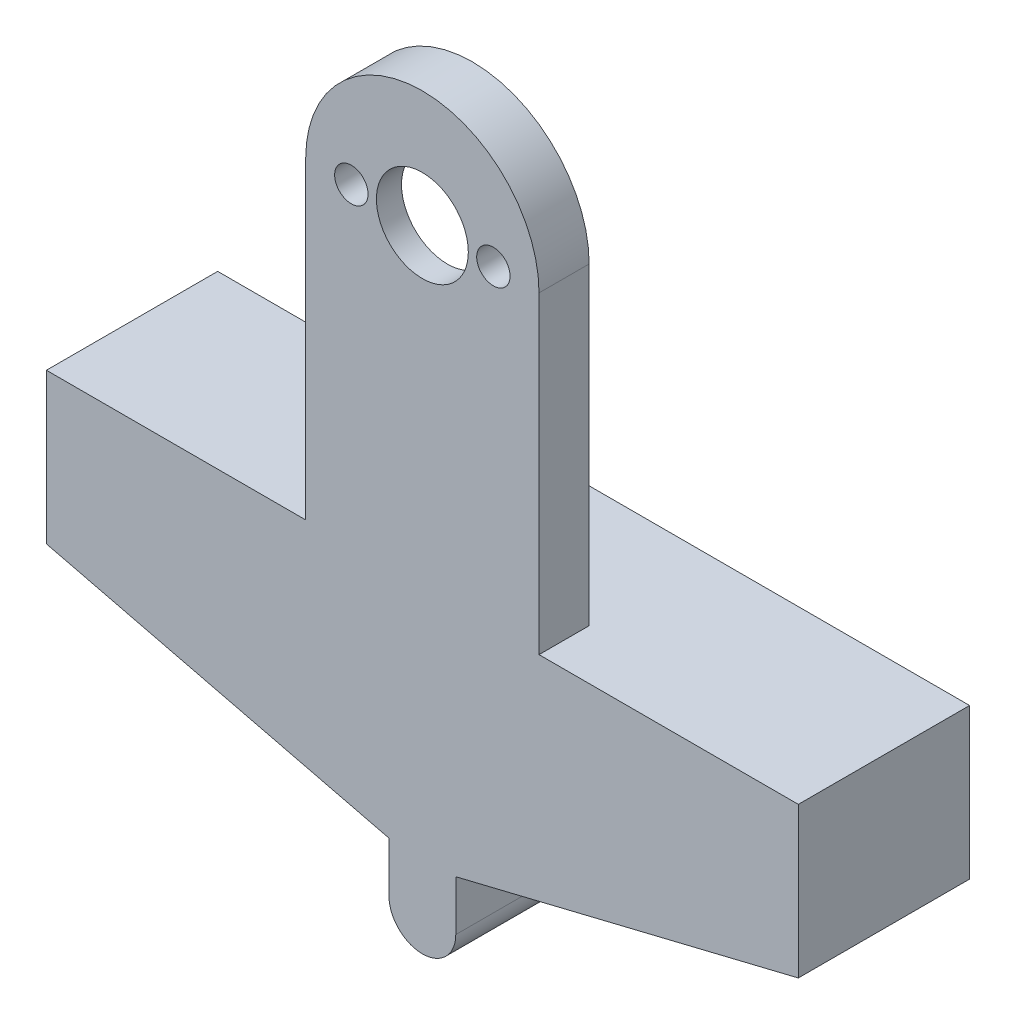
ISO-10303-21;
HEADER;
FILE_DESCRIPTION(('STEP AP214'),'2;1');
FILE_NAME('part.step','',(''),(''),'','','');
FILE_SCHEMA(('AUTOMOTIVE_DESIGN { 1 0 10303 214 1 1 1 1 }'));
ENDSEC;
DATA;
#1=APPLICATION_CONTEXT('core data for automotive mechanical design processes');
#2=APPLICATION_PROTOCOL_DEFINITION('international standard','automotive_design',2000,#1);
#3=PRODUCT_CONTEXT('',#1,'mechanical');
#4=PRODUCT('Part','Part','',(#3));
#5=PRODUCT_RELATED_PRODUCT_CATEGORY('part','',(#4));
#6=PRODUCT_DEFINITION_FORMATION('','',#4);
#7=PRODUCT_DEFINITION_CONTEXT('part definition',#1,'design');
#8=PRODUCT_DEFINITION('design','',#6,#7);
#9=PRODUCT_DEFINITION_SHAPE('','',#8);
#10=(LENGTH_UNIT() NAMED_UNIT(*) SI_UNIT(.MILLI.,.METRE.));
#11=(NAMED_UNIT(*) PLANE_ANGLE_UNIT() SI_UNIT($,.RADIAN.));
#12=(NAMED_UNIT(*) SI_UNIT($,.STERADIAN.) SOLID_ANGLE_UNIT());
#13=UNCERTAINTY_MEASURE_WITH_UNIT(LENGTH_MEASURE(1.E-05),#10,'distance_accuracy_value','');
#14=(GEOMETRIC_REPRESENTATION_CONTEXT(3) GLOBAL_UNCERTAINTY_ASSIGNED_CONTEXT((#13)) GLOBAL_UNIT_ASSIGNED_CONTEXT((#10,
#11,#12)) REPRESENTATION_CONTEXT('',''));
#15=CARTESIAN_POINT('',(0.,0.,0.));
#16=DIRECTION('',(0.,0.,1.));
#17=DIRECTION('',(1.,0.,0.));
#18=AXIS2_PLACEMENT_3D('',#15,#16,#17);
#19=CARTESIAN_POINT('',(-8.50000000000001,46.5,8.));
#20=DIRECTION('',(0.,0.,1.));
#21=DIRECTION('',(1.,0.,0.));
#22=AXIS2_PLACEMENT_3D('',#19,#20,#21);
#23=CYLINDRICAL_SURFACE('',#22,2.);
#24=CARTESIAN_POINT('',(-8.50000000000001,46.5,14.));
#25=DIRECTION('',(0.,0.,1.));
#26=DIRECTION('',(1.,0.,0.));
#27=AXIS2_PLACEMENT_3D('',#24,#25,#26);
#28=CIRCLE('',#27,2.);
#29=CARTESIAN_POINT('',(-6.5,46.5,14.));
#30=VERTEX_POINT('',#29);
#31=EDGE_CURVE('E250',#30,#30,#28,.T.);
#32=ORIENTED_EDGE('',*,*,#31,.T.);
#33=EDGE_LOOP('',(#32));
#34=FACE_BOUND('',#33,.T.);
#35=CARTESIAN_POINT('',(-8.50000000000001,46.5,11.));
#36=DIRECTION('',(0.,0.,-1.));
#37=DIRECTION('',(-1.,0.,0.));
#38=AXIS2_PLACEMENT_3D('',#35,#36,#37);
#39=CIRCLE('',#38,2.);
#40=CARTESIAN_POINT('',(-10.5,46.5,11.));
#41=VERTEX_POINT('',#40);
#42=EDGE_CURVE('E235',#41,#41,#39,.F.);
#43=ORIENTED_EDGE('',*,*,#42,.F.);
#44=EDGE_LOOP('',(#43));
#45=FACE_BOUND('',#44,.T.);
#46=ADVANCED_FACE('F41',(#34,#45),#23,.F.);
#47=CARTESIAN_POINT('',(8.49999999999999,46.5,8.));
#48=DIRECTION('',(0.,0.,1.));
#49=DIRECTION('',(1.,0.,0.));
#50=AXIS2_PLACEMENT_3D('',#47,#48,#49);
#51=CYLINDRICAL_SURFACE('',#50,2.);
#52=CARTESIAN_POINT('',(8.49999999999999,46.5,14.));
#53=DIRECTION('',(0.,0.,1.));
#54=DIRECTION('',(1.,0.,0.));
#55=AXIS2_PLACEMENT_3D('',#52,#53,#54);
#56=CIRCLE('',#55,2.);
#57=CARTESIAN_POINT('',(10.5,46.5,14.));
#58=VERTEX_POINT('',#57);
#59=EDGE_CURVE('E246',#58,#58,#56,.T.);
#60=ORIENTED_EDGE('',*,*,#59,.T.);
#61=EDGE_LOOP('',(#60));
#62=FACE_BOUND('',#61,.T.);
#63=CARTESIAN_POINT('',(8.49999999999999,46.5,11.));
#64=DIRECTION('',(0.,0.,-1.));
#65=DIRECTION('',(-1.,0.,0.));
#66=AXIS2_PLACEMENT_3D('',#63,#64,#65);
#67=CIRCLE('',#66,2.);
#68=CARTESIAN_POINT('',(6.5,46.5,11.));
#69=VERTEX_POINT('',#68);
#70=EDGE_CURVE('E944',#69,#69,#67,.F.);
#71=ORIENTED_EDGE('',*,*,#70,.F.);
#72=EDGE_LOOP('',(#71));
#73=FACE_BOUND('',#72,.T.);
#74=ADVANCED_FACE('F544',(#62,#73),#51,.F.);
#75=CARTESIAN_POINT('',(0.,46.5,8.));
#76=DIRECTION('',(0.,0.,1.));
#77=DIRECTION('',(1.,0.,0.));
#78=AXIS2_PLACEMENT_3D('',#75,#76,#77);
#79=CYLINDRICAL_SURFACE('',#78,5.5);
#80=CARTESIAN_POINT('',(0.,46.5,14.));
#81=DIRECTION('',(0.,0.,1.));
#82=DIRECTION('',(1.,0.,0.));
#83=AXIS2_PLACEMENT_3D('',#80,#81,#82);
#84=CIRCLE('',#83,5.5);
#85=CARTESIAN_POINT('',(5.49999999999999,46.5,14.));
#86=VERTEX_POINT('',#85);
#87=EDGE_CURVE('E242',#86,#86,#84,.T.);
#88=ORIENTED_EDGE('',*,*,#87,.T.);
#89=EDGE_LOOP('',(#88));
#90=FACE_BOUND('',#89,.T.);
#91=CARTESIAN_POINT('',(0.,46.5,11.));
#92=DIRECTION('',(0.,0.,-1.));
#93=DIRECTION('',(-1.,0.,0.));
#94=AXIS2_PLACEMENT_3D('',#91,#92,#93);
#95=CIRCLE('',#94,5.5);
#96=CARTESIAN_POINT('',(-5.50000000000001,46.5,11.));
#97=VERTEX_POINT('',#96);
#98=EDGE_CURVE('E45',#97,#97,#95,.F.);
#99=ORIENTED_EDGE('',*,*,#98,.F.);
#100=EDGE_LOOP('',(#99));
#101=FACE_BOUND('',#100,.T.);
#102=ADVANCED_FACE('F541',(#90,#101),#79,.F.);
#103=CARTESIAN_POINT('',(0.,0.,0.));
#104=DIRECTION('',(0.,0.,1.));
#105=DIRECTION('',(1.,0.,0.));
#106=AXIS2_PLACEMENT_3D('',#103,#104,#105);
#107=PLANE('',#106);
#108=DIRECTION('',(0.,-1.,0.));
#109=VECTOR('',#108,1.);
#110=CARTESIAN_POINT('',(4.,0.,0.));
#111=LINE('',#110,#109);
#112=CARTESIAN_POINT('',(4.,-9.,0.));
#113=VERTEX_POINT('',#112);
#114=CARTESIAN_POINT('',(4.00000000000001,-19.,0.));
#115=VERTEX_POINT('',#114);
#116=EDGE_CURVE('E357',#113,#115,#111,.T.);
#117=ORIENTED_EDGE('',*,*,#116,.F.);
#118=DIRECTION('',(1.,0.,0.));
#119=VECTOR('',#118,1.);
#120=CARTESIAN_POINT('',(0.,-9.,0.));
#121=LINE('',#120,#119);
#122=CARTESIAN_POINT('',(45.,-9.,0.));
#123=VERTEX_POINT('',#122);
#124=EDGE_CURVE('E271',#113,#123,#121,.T.);
#125=ORIENTED_EDGE('',*,*,#124,.T.);
#126=DIRECTION('',(0.97152033878313,0.236956180191007,0.));
#127=VECTOR('',#126,1.);
#128=CARTESIAN_POINT('',(4.5985401459854,-18.8540145985401,0.));
#129=LINE('',#128,#127);
#130=EDGE_CURVE('E363',#115,#123,#129,.T.);
#131=ORIENTED_EDGE('',*,*,#130,.F.);
#132=EDGE_LOOP('',(#117,#125,#131));
#133=FACE_BOUND('',#132,.T.);
#134=ADVANCED_FACE('F528',(#133),#107,.F.);
#135=CARTESIAN_POINT('',(4.,0.,14.));
#136=DIRECTION('',(1.,0.,0.));
#137=DIRECTION('',(0.,1.,0.));
#138=AXIS2_PLACEMENT_3D('',#135,#136,#137);
#139=PLANE('',#138);
#140=DIRECTION('',(0.,-1.,0.));
#141=VECTOR('',#140,1.);
#142=CARTESIAN_POINT('',(4.,0.,14.));
#143=LINE('',#142,#141);
#144=CARTESIAN_POINT('',(4.00000000000001,-19.,14.));
#145=VERTEX_POINT('',#144);
#146=CARTESIAN_POINT('',(4.00000000000001,-25.,14.));
#147=VERTEX_POINT('',#146);
#148=EDGE_CURVE('E400',#145,#147,#143,.T.);
#149=ORIENTED_EDGE('',*,*,#148,.T.);
#150=DIRECTION('',(0.,0.,-1.));
#151=VECTOR('',#150,1.);
#152=CARTESIAN_POINT('',(4.00000000000001,-25.,14.));
#153=LINE('',#152,#151);
#154=CARTESIAN_POINT('',(4.00000000000001,-25.,-6.5));
#155=VERTEX_POINT('',#154);
#156=EDGE_CURVE('E11',#147,#155,#153,.T.);
#157=ORIENTED_EDGE('',*,*,#156,.T.);
#158=DIRECTION('',(0.,-1.,0.));
#159=VECTOR('',#158,1.);
#160=CARTESIAN_POINT('',(4.,0.,-6.5));
#161=LINE('',#160,#159);
#162=CARTESIAN_POINT('',(4.,-9.,-6.5));
#163=VERTEX_POINT('',#162);
#164=EDGE_CURVE('E305',#163,#155,#161,.T.);
#165=ORIENTED_EDGE('',*,*,#164,.F.);
#166=DIRECTION('',(0.,0.,1.));
#167=VECTOR('',#166,1.);
#168=CARTESIAN_POINT('',(4.,-9.,-6.5));
#169=LINE('',#168,#167);
#170=EDGE_CURVE('E367',#163,#113,#169,.T.);
#171=ORIENTED_EDGE('',*,*,#170,.T.);
#172=ORIENTED_EDGE('',*,*,#116,.T.);
#173=DIRECTION('',(0.,0.,-1.));
#174=VECTOR('',#173,1.);
#175=CARTESIAN_POINT('',(4.00000000000001,-19.,14.));
#176=LINE('',#175,#174);
#177=EDGE_CURVE('E452',#145,#115,#176,.T.);
#178=ORIENTED_EDGE('',*,*,#177,.F.);
#179=EDGE_LOOP('',(#149,#157,#165,#171,#172,#178));
#180=FACE_BOUND('',#179,.T.);
#181=ADVANCED_FACE('F484',(#180),#139,.T.);
#182=CARTESIAN_POINT('',(4.5985401459854,-18.8540145985401,14.));
#183=DIRECTION('',(-0.236956180191007,0.97152033878313,0.));
#184=DIRECTION('',(-0.97152033878313,-0.236956180191007,0.));
#185=AXIS2_PLACEMENT_3D('',#182,#183,#184);
#186=PLANE('',#185);
#187=ORIENTED_EDGE('',*,*,#130,.T.);
#188=DIRECTION('',(0.,0.,-1.));
#189=VECTOR('',#188,1.);
#190=CARTESIAN_POINT('',(45.,-9.,14.));
#191=LINE('',#190,#189);
#192=CARTESIAN_POINT('',(45.,-9.,14.));
#193=VERTEX_POINT('',#192);
#194=EDGE_CURVE('E448',#193,#123,#191,.T.);
#195=ORIENTED_EDGE('',*,*,#194,.F.);
#196=DIRECTION('',(0.97152033878313,0.236956180191007,0.));
#197=VECTOR('',#196,1.);
#198=CARTESIAN_POINT('',(4.5985401459854,-18.8540145985401,14.));
#199=LINE('',#198,#197);
#200=EDGE_CURVE('E404',#145,#193,#199,.T.);
#201=ORIENTED_EDGE('',*,*,#200,.F.);
#202=ORIENTED_EDGE('',*,*,#177,.T.);
#203=EDGE_LOOP('',(#187,#195,#201,#202));
#204=FACE_BOUND('',#203,.T.);
#205=ADVANCED_FACE('F491',(#204),#186,.F.);
#206=CARTESIAN_POINT('',(45.,0.,14.));
#207=DIRECTION('',(-1.,0.,0.));
#208=DIRECTION('',(0.,0.,1.));
#209=AXIS2_PLACEMENT_3D('',#206,#207,#208);
#210=PLANE('',#209);
#211=ORIENTED_EDGE('',*,*,#194,.T.);
#212=DIRECTION('',(0.,0.,1.));
#213=VECTOR('',#212,1.);
#214=CARTESIAN_POINT('',(45.,-9.,-6.5));
#215=LINE('',#214,#213);
#216=CARTESIAN_POINT('',(45.,-9.,-6.5));
#217=VERTEX_POINT('',#216);
#218=EDGE_CURVE('E364',#217,#123,#215,.T.);
#219=ORIENTED_EDGE('',*,*,#218,.F.);
#220=DIRECTION('',(0.,1.,0.));
#221=VECTOR('',#220,1.);
#222=CARTESIAN_POINT('',(45.,0.,-6.5));
#223=LINE('',#222,#221);
#224=CARTESIAN_POINT('',(45.,9.00000000000001,-6.5));
#225=VERTEX_POINT('',#224);
#226=EDGE_CURVE('E309',#217,#225,#223,.T.);
#227=ORIENTED_EDGE('',*,*,#226,.T.);
#228=DIRECTION('',(0.,0.,-1.));
#229=VECTOR('',#228,1.);
#230=CARTESIAN_POINT('',(45.,9.00000000000001,14.));
#231=LINE('',#230,#229);
#232=CARTESIAN_POINT('',(45.,9.00000000000001,14.));
#233=VERTEX_POINT('',#232);
#234=EDGE_CURVE('E445',#233,#225,#231,.T.);
#235=ORIENTED_EDGE('',*,*,#234,.F.);
#236=DIRECTION('',(0.,1.,0.));
#237=VECTOR('',#236,1.);
#238=CARTESIAN_POINT('',(45.,0.,14.));
#239=LINE('',#238,#237);
#240=EDGE_CURVE('E408',#193,#233,#239,.T.);
#241=ORIENTED_EDGE('',*,*,#240,.F.);
#242=EDGE_LOOP('',(#211,#219,#227,#235,#241));
#243=FACE_BOUND('',#242,.T.);
#244=ADVANCED_FACE('F496',(#243),#210,.F.);
#245=CARTESIAN_POINT('',(0.,9.00000000000001,14.));
#246=DIRECTION('',(0.,1.,0.));
#247=DIRECTION('',(0.,0.,1.));
#248=AXIS2_PLACEMENT_3D('',#245,#246,#247);
#249=PLANE('',#248);
#250=DIRECTION('',(0.,0.,1.));
#251=VECTOR('',#250,1.);
#252=CARTESIAN_POINT('',(-13.964514824375,9.00000000000001,8.));
#253=LINE('',#252,#251);
#254=CARTESIAN_POINT('',(-13.964514824375,9.00000000000001,8.));
#255=VERTEX_POINT('',#254);
#256=CARTESIAN_POINT('',(-13.964514824375,9.00000000000001,14.));
#257=VERTEX_POINT('',#256);
#258=EDGE_CURVE('E216',#255,#257,#253,.T.);
#259=ORIENTED_EDGE('',*,*,#258,.F.);
#260=DIRECTION('',(-1.,0.,0.));
#261=VECTOR('',#260,1.);
#262=CARTESIAN_POINT('',(0.,9.00000000000001,8.));
#263=LINE('',#262,#261);
#264=CARTESIAN_POINT('',(13.964514824375,9.00000000000001,8.));
#265=VERTEX_POINT('',#264);
#266=EDGE_CURVE('E224',#265,#255,#263,.T.);
#267=ORIENTED_EDGE('',*,*,#266,.F.);
#268=DIRECTION('',(0.,0.,1.));
#269=VECTOR('',#268,1.);
#270=CARTESIAN_POINT('',(13.964514824375,9.00000000000001,8.));
#271=LINE('',#270,#269);
#272=CARTESIAN_POINT('',(13.964514824375,9.00000000000001,14.));
#273=VERTEX_POINT('',#272);
#274=EDGE_CURVE('E262',#265,#273,#271,.T.);
#275=ORIENTED_EDGE('',*,*,#274,.T.);
#276=DIRECTION('',(1.,0.,0.));
#277=VECTOR('',#276,1.);
#278=CARTESIAN_POINT('',(0.,9.00000000000001,14.));
#279=LINE('',#278,#277);
#280=EDGE_CURVE('E412',#273,#233,#279,.T.);
#281=ORIENTED_EDGE('',*,*,#280,.T.);
#282=ORIENTED_EDGE('',*,*,#234,.T.);
#283=DIRECTION('',(1.,0.,0.));
#284=VECTOR('',#283,1.);
#285=CARTESIAN_POINT('',(0.,9.00000000000001,-6.5));
#286=LINE('',#285,#284);
#287=CARTESIAN_POINT('',(-45.,9.00000000000001,-6.5));
#288=VERTEX_POINT('',#287);
#289=EDGE_CURVE('E313',#288,#225,#286,.T.);
#290=ORIENTED_EDGE('',*,*,#289,.F.);
#291=DIRECTION('',(0.,0.,-1.));
#292=VECTOR('',#291,1.);
#293=CARTESIAN_POINT('',(-45.,9.00000000000001,14.));
#294=LINE('',#293,#292);
#295=CARTESIAN_POINT('',(-45.,9.00000000000001,14.));
#296=VERTEX_POINT('',#295);
#297=EDGE_CURVE('E442',#296,#288,#294,.T.);
#298=ORIENTED_EDGE('',*,*,#297,.F.);
#299=EDGE_CURVE('E413',#296,#257,#279,.T.);
#300=ORIENTED_EDGE('',*,*,#299,.T.);
#301=EDGE_LOOP('',(#259,#267,#275,#281,#282,#290,#298,#300));
#302=FACE_BOUND('',#301,.T.);
#303=ADVANCED_FACE('F500',(#302),#249,.T.);
#304=CARTESIAN_POINT('',(-45.,0.,14.));
#305=DIRECTION('',(-1.,0.,0.));
#306=DIRECTION('',(0.,0.,1.));
#307=AXIS2_PLACEMENT_3D('',#304,#305,#306);
#308=PLANE('',#307);
#309=ORIENTED_EDGE('',*,*,#297,.T.);
#310=DIRECTION('',(0.,1.,0.));
#311=VECTOR('',#310,1.);
#312=CARTESIAN_POINT('',(-45.,0.,-6.5));
#313=LINE('',#312,#311);
#314=CARTESIAN_POINT('',(-45.,-9.,-6.5));
#315=VERTEX_POINT('',#314);
#316=EDGE_CURVE('E317',#315,#288,#313,.T.);
#317=ORIENTED_EDGE('',*,*,#316,.F.);
#318=DIRECTION('',(0.,0.,1.));
#319=VECTOR('',#318,1.);
#320=CARTESIAN_POINT('',(-45.,-9.,-6.5));
#321=LINE('',#320,#319);
#322=CARTESIAN_POINT('',(-45.,-9.,0.));
#323=VERTEX_POINT('',#322);
#324=EDGE_CURVE('E360',#315,#323,#321,.T.);
#325=ORIENTED_EDGE('',*,*,#324,.T.);
#326=DIRECTION('',(0.,0.,-1.));
#327=VECTOR('',#326,1.);
#328=CARTESIAN_POINT('',(-45.,-9.,14.));
#329=LINE('',#328,#327);
#330=CARTESIAN_POINT('',(-45.,-9.,14.));
#331=VERTEX_POINT('',#330);
#332=EDGE_CURVE('E438',#331,#323,#329,.T.);
#333=ORIENTED_EDGE('',*,*,#332,.F.);
#334=DIRECTION('',(0.,1.,0.));
#335=VECTOR('',#334,1.);
#336=CARTESIAN_POINT('',(-45.,0.,14.));
#337=LINE('',#336,#335);
#338=EDGE_CURVE('E417',#331,#296,#337,.T.);
#339=ORIENTED_EDGE('',*,*,#338,.T.);
#340=EDGE_LOOP('',(#309,#317,#325,#333,#339));
#341=FACE_BOUND('',#340,.T.);
#342=ADVANCED_FACE('F509',(#341),#308,.T.);
#343=CARTESIAN_POINT('',(-4.5985401459854,-18.8540145985401,14.));
#344=DIRECTION('',(-0.236956180191007,-0.97152033878313,0.));
#345=DIRECTION('',(0.97152033878313,-0.236956180191007,0.));
#346=AXIS2_PLACEMENT_3D('',#343,#344,#345);
#347=PLANE('',#346);
#348=DIRECTION('',(-0.97152033878313,0.236956180191007,0.));
#349=VECTOR('',#348,1.);
#350=CARTESIAN_POINT('',(-4.5985401459854,-18.8540145985401,0.));
#351=LINE('',#350,#349);
#352=CARTESIAN_POINT('',(-3.99999999999999,-19.,0.));
#353=VERTEX_POINT('',#352);
#354=EDGE_CURVE('E405',#353,#323,#351,.T.);
#355=ORIENTED_EDGE('',*,*,#354,.F.);
#356=DIRECTION('',(0.,0.,-1.));
#357=VECTOR('',#356,1.);
#358=CARTESIAN_POINT('',(-3.99999999999999,-19.,14.));
#359=LINE('',#358,#357);
#360=CARTESIAN_POINT('',(-3.99999999999999,-19.,14.));
#361=VERTEX_POINT('',#360);
#362=EDGE_CURVE('E428',#361,#353,#359,.T.);
#363=ORIENTED_EDGE('',*,*,#362,.F.);
#364=DIRECTION('',(-0.97152033878313,0.236956180191007,0.));
#365=VECTOR('',#364,1.);
#366=CARTESIAN_POINT('',(-4.5985401459854,-18.8540145985401,14.));
#367=LINE('',#366,#365);
#368=EDGE_CURVE('E421',#361,#331,#367,.T.);
#369=ORIENTED_EDGE('',*,*,#368,.T.);
#370=ORIENTED_EDGE('',*,*,#332,.T.);
#371=EDGE_LOOP('',(#355,#363,#369,#370));
#372=FACE_BOUND('',#371,.T.);
#373=ADVANCED_FACE('F516',(#372),#347,.T.);
#374=CARTESIAN_POINT('',(-4.,0.,14.));
#375=DIRECTION('',(1.,0.,0.));
#376=DIRECTION('',(0.,1.,0.));
#377=AXIS2_PLACEMENT_3D('',#374,#375,#376);
#378=PLANE('',#377);
#379=DIRECTION('',(0.,-1.,0.));
#380=VECTOR('',#379,1.);
#381=CARTESIAN_POINT('',(-4.,0.,-6.5));
#382=LINE('',#381,#380);
#383=CARTESIAN_POINT('',(-4.,-9.,-6.5));
#384=VERTEX_POINT('',#383);
#385=CARTESIAN_POINT('',(-3.99999999999999,-25.,-6.5));
#386=VERTEX_POINT('',#385);
#387=EDGE_CURVE('E300',#384,#386,#382,.T.);
#388=ORIENTED_EDGE('',*,*,#387,.T.);
#389=DIRECTION('',(0.,0.,-1.));
#390=VECTOR('',#389,1.);
#391=CARTESIAN_POINT('',(-3.99999999999999,-25.,14.));
#392=LINE('',#391,#390);
#393=CARTESIAN_POINT('',(-3.99999999999999,-25.,14.));
#394=VERTEX_POINT('',#393);
#395=EDGE_CURVE('E462',#386,#394,#392,.F.);
#396=ORIENTED_EDGE('',*,*,#395,.T.);
#397=DIRECTION('',(0.,-1.,0.));
#398=VECTOR('',#397,1.);
#399=CARTESIAN_POINT('',(-4.,0.,14.));
#400=LINE('',#399,#398);
#401=EDGE_CURVE('E425',#361,#394,#400,.T.);
#402=ORIENTED_EDGE('',*,*,#401,.F.);
#403=ORIENTED_EDGE('',*,*,#362,.T.);
#404=DIRECTION('',(0.,-1.,0.));
#405=VECTOR('',#404,1.);
#406=CARTESIAN_POINT('',(-4.,0.,0.));
#407=LINE('',#406,#405);
#408=CARTESIAN_POINT('',(-4.,-9.,0.));
#409=VERTEX_POINT('',#408);
#410=EDGE_CURVE('E354',#409,#353,#407,.T.);
#411=ORIENTED_EDGE('',*,*,#410,.F.);
#412=DIRECTION('',(0.,0.,1.));
#413=VECTOR('',#412,1.);
#414=CARTESIAN_POINT('',(-4.,-9.,-6.5));
#415=LINE('',#414,#413);
#416=EDGE_CURVE('E370',#384,#409,#415,.T.);
#417=ORIENTED_EDGE('',*,*,#416,.F.);
#418=EDGE_LOOP('',(#388,#396,#402,#403,#411,#417));
#419=FACE_BOUND('',#418,.T.);
#420=ADVANCED_FACE('F520',(#419),#378,.F.);
#421=CARTESIAN_POINT('',(0.,0.,14.));
#422=DIRECTION('',(0.,0.,1.));
#423=DIRECTION('',(1.,0.,0.));
#424=AXIS2_PLACEMENT_3D('',#421,#422,#423);
#425=PLANE('',#424);
#426=ORIENTED_EDGE('',*,*,#401,.T.);
#427=CARTESIAN_POINT('',(0.,-25.,14.));
#428=DIRECTION('',(0.,0.,1.));
#429=DIRECTION('',(1.,0.,0.));
#430=AXIS2_PLACEMENT_3D('',#427,#428,#429);
#431=CIRCLE('',#430,4.);
#432=CARTESIAN_POINT('',(0.,-29.,14.));
#433=VERTEX_POINT('',#432);
#434=EDGE_CURVE('E51',#394,#433,#431,.T.);
#435=ORIENTED_EDGE('',*,*,#434,.T.);
#436=CARTESIAN_POINT('',(0.,-25.,14.));
#437=DIRECTION('',(0.,0.,1.));
#438=DIRECTION('',(1.,0.,0.));
#439=AXIS2_PLACEMENT_3D('',#436,#437,#438);
#440=CIRCLE('',#439,4.);
#441=EDGE_CURVE('E466',#433,#147,#440,.T.);
#442=ORIENTED_EDGE('',*,*,#441,.T.);
#443=ORIENTED_EDGE('',*,*,#148,.F.);
#444=ORIENTED_EDGE('',*,*,#200,.T.);
#445=ORIENTED_EDGE('',*,*,#240,.T.);
#446=ORIENTED_EDGE('',*,*,#280,.F.);
#447=DIRECTION('',(0.,-1.,0.));
#448=VECTOR('',#447,1.);
#449=CARTESIAN_POINT('',(13.964514824375,0.,14.));
#450=LINE('',#449,#448);
#451=CARTESIAN_POINT('',(13.964514824375,46.5,14.));
#452=VERTEX_POINT('',#451);
#453=EDGE_CURVE('E59',#452,#273,#450,.T.);
#454=ORIENTED_EDGE('',*,*,#453,.F.);
#455=CARTESIAN_POINT('',(0.,46.5,14.));
#456=DIRECTION('',(0.,0.,1.));
#457=DIRECTION('',(1.,0.,0.));
#458=AXIS2_PLACEMENT_3D('',#455,#456,#457);
#459=CIRCLE('',#458,13.964514824375);
#460=CARTESIAN_POINT('',(-13.964514824375,46.5,14.));
#461=VERTEX_POINT('',#460);
#462=EDGE_CURVE('E254',#452,#461,#459,.T.);
#463=ORIENTED_EDGE('',*,*,#462,.T.);
#464=DIRECTION('',(0.,-1.,0.));
#465=VECTOR('',#464,1.);
#466=CARTESIAN_POINT('',(-13.964514824375,0.,14.));
#467=LINE('',#466,#465);
#468=EDGE_CURVE('E210',#461,#257,#467,.T.);
#469=ORIENTED_EDGE('',*,*,#468,.T.);
#470=ORIENTED_EDGE('',*,*,#299,.F.);
#471=ORIENTED_EDGE('',*,*,#338,.F.);
#472=ORIENTED_EDGE('',*,*,#368,.F.);
#473=EDGE_LOOP('',(#426,#435,#442,#443,#444,#445,#446,#454,#463,#469,#470,#471,#472));
#474=FACE_BOUND('',#473,.T.);
#475=ORIENTED_EDGE('',*,*,#87,.F.);
#476=EDGE_LOOP('',(#475));
#477=FACE_BOUND('',#476,.T.);
#478=ORIENTED_EDGE('',*,*,#59,.F.);
#479=EDGE_LOOP('',(#478));
#480=FACE_BOUND('',#479,.T.);
#481=ORIENTED_EDGE('',*,*,#31,.F.);
#482=EDGE_LOOP('',(#481));
#483=FACE_BOUND('',#482,.T.);
#484=ADVANCED_FACE('F481',(#474,#477,#480,#483),#425,.T.);
#485=ORIENTED_EDGE('',*,*,#354,.T.);
#486=EDGE_CURVE('E350',#323,#409,#121,.T.);
#487=ORIENTED_EDGE('',*,*,#486,.T.);
#488=ORIENTED_EDGE('',*,*,#410,.T.);
#489=EDGE_LOOP('',(#485,#487,#488));
#490=FACE_BOUND('',#489,.T.);
#491=ADVANCED_FACE('F524',(#490),#107,.F.);
#492=CARTESIAN_POINT('',(0.,-9.,-6.5));
#493=DIRECTION('',(0.,-1.,0.));
#494=DIRECTION('',(0.,0.,-1.));
#495=AXIS2_PLACEMENT_3D('',#492,#493,#494);
#496=PLANE('',#495);
#497=ORIENTED_EDGE('',*,*,#486,.F.);
#498=ORIENTED_EDGE('',*,*,#324,.F.);
#499=DIRECTION('',(1.,0.,0.));
#500=VECTOR('',#499,1.);
#501=CARTESIAN_POINT('',(0.,-9.,-6.5));
#502=LINE('',#501,#500);
#503=EDGE_CURVE('E296',#315,#384,#502,.T.);
#504=ORIENTED_EDGE('',*,*,#503,.T.);
#505=ORIENTED_EDGE('',*,*,#416,.T.);
#506=EDGE_LOOP('',(#497,#498,#504,#505));
#507=FACE_BOUND('',#506,.T.);
#508=ADVANCED_FACE('F522',(#507),#496,.T.);
#509=ORIENTED_EDGE('',*,*,#124,.F.);
#510=ORIENTED_EDGE('',*,*,#170,.F.);
#511=EDGE_CURVE('E301',#163,#217,#502,.T.);
#512=ORIENTED_EDGE('',*,*,#511,.T.);
#513=ORIENTED_EDGE('',*,*,#218,.T.);
#514=EDGE_LOOP('',(#509,#510,#512,#513));
#515=FACE_BOUND('',#514,.T.);
#516=ADVANCED_FACE('F533',(#515),#496,.T.);
#517=CARTESIAN_POINT('',(-7.5,0.,-6.5));
#518=DIRECTION('',(1.,0.,0.));
#519=DIRECTION('',(0.,0.,-1.));
#520=AXIS2_PLACEMENT_3D('',#517,#518,#519);
#521=PLANE('',#520);
#522=DIRECTION('',(0.,1.,0.));
#523=VECTOR('',#522,1.);
#524=CARTESIAN_POINT('',(-7.5,0.,0.));
#525=LINE('',#524,#523);
#526=CARTESIAN_POINT('',(-7.5,-2.99999999999999,0.));
#527=VERTEX_POINT('',#526);
#528=CARTESIAN_POINT('',(-7.5,3.00000000000001,0.));
#529=VERTEX_POINT('',#528);
#530=EDGE_CURVE('E336',#527,#529,#525,.T.);
#531=ORIENTED_EDGE('',*,*,#530,.T.);
#532=DIRECTION('',(0.,0.,1.));
#533=VECTOR('',#532,1.);
#534=CARTESIAN_POINT('',(-7.5,3.00000000000001,-6.5));
#535=LINE('',#534,#533);
#536=CARTESIAN_POINT('',(-7.5,3.00000000000001,-6.5));
#537=VERTEX_POINT('',#536);
#538=EDGE_CURVE('E373',#537,#529,#535,.T.);
#539=ORIENTED_EDGE('',*,*,#538,.F.);
#540=DIRECTION('',(0.,1.,0.));
#541=VECTOR('',#540,1.);
#542=CARTESIAN_POINT('',(-7.5,0.,-6.5));
#543=LINE('',#542,#541);
#544=CARTESIAN_POINT('',(-7.5,-2.99999999999999,-6.5));
#545=VERTEX_POINT('',#544);
#546=EDGE_CURVE('E282',#545,#537,#543,.T.);
#547=ORIENTED_EDGE('',*,*,#546,.F.);
#548=DIRECTION('',(0.,0.,1.));
#549=VECTOR('',#548,1.);
#550=CARTESIAN_POINT('',(-7.5,-2.99999999999999,-6.5));
#551=LINE('',#550,#549);
#552=EDGE_CURVE('E383',#545,#527,#551,.T.);
#553=ORIENTED_EDGE('',*,*,#552,.T.);
#554=EDGE_LOOP('',(#531,#539,#547,#553));
#555=FACE_BOUND('',#554,.T.);
#556=ADVANCED_FACE('F564',(#555),#521,.F.);
#557=CARTESIAN_POINT('',(0.,3.00000000000001,-6.5));
#558=DIRECTION('',(0.,-1.,0.));
#559=DIRECTION('',(0.,0.,-1.));
#560=AXIS2_PLACEMENT_3D('',#557,#558,#559);
#561=PLANE('',#560);
#562=DIRECTION('',(1.,0.,0.));
#563=VECTOR('',#562,1.);
#564=CARTESIAN_POINT('',(0.,3.00000000000001,0.));
#565=LINE('',#564,#563);
#566=CARTESIAN_POINT('',(-22.5,3.00000000000001,0.));
#567=VERTEX_POINT('',#566);
#568=EDGE_CURVE('E346',#567,#529,#565,.T.);
#569=ORIENTED_EDGE('',*,*,#568,.F.);
#570=DIRECTION('',(0.,0.,1.));
#571=VECTOR('',#570,1.);
#572=CARTESIAN_POINT('',(-22.5,3.00000000000001,-6.5));
#573=LINE('',#572,#571);
#574=CARTESIAN_POINT('',(-22.5,3.00000000000001,-6.5));
#575=VERTEX_POINT('',#574);
#576=EDGE_CURVE('E377',#575,#567,#573,.T.);
#577=ORIENTED_EDGE('',*,*,#576,.F.);
#578=DIRECTION('',(1.,0.,0.));
#579=VECTOR('',#578,1.);
#580=CARTESIAN_POINT('',(0.,3.00000000000001,-6.5));
#581=LINE('',#580,#579);
#582=EDGE_CURVE('E292',#575,#537,#581,.T.);
#583=ORIENTED_EDGE('',*,*,#582,.T.);
#584=ORIENTED_EDGE('',*,*,#538,.T.);
#585=EDGE_LOOP('',(#569,#577,#583,#584));
#586=FACE_BOUND('',#585,.T.);
#587=ADVANCED_FACE('F566',(#586),#561,.T.);
#588=CARTESIAN_POINT('',(-22.5,0.,-6.5));
#589=DIRECTION('',(1.,0.,0.));
#590=DIRECTION('',(0.,0.,-1.));
#591=AXIS2_PLACEMENT_3D('',#588,#589,#590);
#592=PLANE('',#591);
#593=DIRECTION('',(0.,1.,0.));
#594=VECTOR('',#593,1.);
#595=CARTESIAN_POINT('',(-22.5,0.,0.));
#596=LINE('',#595,#594);
#597=CARTESIAN_POINT('',(-22.5,-2.99999999999999,0.));
#598=VERTEX_POINT('',#597);
#599=EDGE_CURVE('E342',#598,#567,#596,.T.);
#600=ORIENTED_EDGE('',*,*,#599,.F.);
#601=DIRECTION('',(0.,0.,1.));
#602=VECTOR('',#601,1.);
#603=CARTESIAN_POINT('',(-22.5,-2.99999999999999,-6.5));
#604=LINE('',#603,#602);
#605=CARTESIAN_POINT('',(-22.5,-2.99999999999999,-6.5));
#606=VERTEX_POINT('',#605);
#607=EDGE_CURVE('E380',#606,#598,#604,.T.);
#608=ORIENTED_EDGE('',*,*,#607,.F.);
#609=DIRECTION('',(0.,1.,0.));
#610=VECTOR('',#609,1.);
#611=CARTESIAN_POINT('',(-22.5,0.,-6.5));
#612=LINE('',#611,#610);
#613=EDGE_CURVE('E288',#606,#575,#612,.T.);
#614=ORIENTED_EDGE('',*,*,#613,.T.);
#615=ORIENTED_EDGE('',*,*,#576,.T.);
#616=EDGE_LOOP('',(#600,#608,#614,#615));
#617=FACE_BOUND('',#616,.T.);
#618=ADVANCED_FACE('F569',(#617),#592,.T.);
#619=CARTESIAN_POINT('',(22.5,0.,-6.5));
#620=DIRECTION('',(1.,0.,0.));
#621=DIRECTION('',(0.,0.,-1.));
#622=AXIS2_PLACEMENT_3D('',#619,#620,#621);
#623=PLANE('',#622);
#624=DIRECTION('',(0.,1.,0.));
#625=VECTOR('',#624,1.);
#626=CARTESIAN_POINT('',(22.5,0.,0.));
#627=LINE('',#626,#625);
#628=CARTESIAN_POINT('',(22.5,-2.99999999999999,0.));
#629=VERTEX_POINT('',#628);
#630=CARTESIAN_POINT('',(22.5,3.00000000000001,0.));
#631=VERTEX_POINT('',#630);
#632=EDGE_CURVE('E322',#629,#631,#627,.T.);
#633=ORIENTED_EDGE('',*,*,#632,.T.);
#634=DIRECTION('',(0.,0.,1.));
#635=VECTOR('',#634,1.);
#636=CARTESIAN_POINT('',(22.5,3.00000000000001,-6.5));
#637=LINE('',#636,#635);
#638=CARTESIAN_POINT('',(22.5,3.00000000000001,-6.5));
#639=VERTEX_POINT('',#638);
#640=EDGE_CURVE('E387',#639,#631,#637,.T.);
#641=ORIENTED_EDGE('',*,*,#640,.F.);
#642=DIRECTION('',(0.,1.,0.));
#643=VECTOR('',#642,1.);
#644=CARTESIAN_POINT('',(22.5,0.,-6.5));
#645=LINE('',#644,#643);
#646=CARTESIAN_POINT('',(22.5,-2.99999999999999,-6.5));
#647=VERTEX_POINT('',#646);
#648=EDGE_CURVE('E267',#647,#639,#645,.T.);
#649=ORIENTED_EDGE('',*,*,#648,.F.);
#650=DIRECTION('',(0.,0.,1.));
#651=VECTOR('',#650,1.);
#652=CARTESIAN_POINT('',(22.5,-2.99999999999999,-6.5));
#653=LINE('',#652,#651);
#654=EDGE_CURVE('E321',#647,#629,#653,.T.);
#655=ORIENTED_EDGE('',*,*,#654,.T.);
#656=EDGE_LOOP('',(#633,#641,#649,#655));
#657=FACE_BOUND('',#656,.T.);
#658=ADVANCED_FACE('F573',(#657),#623,.F.);
#659=CARTESIAN_POINT('',(0.,3.00000000000001,-6.5));
#660=DIRECTION('',(0.,-1.,0.));
#661=DIRECTION('',(0.,0.,-1.));
#662=AXIS2_PLACEMENT_3D('',#659,#660,#661);
#663=PLANE('',#662);
#664=DIRECTION('',(1.,0.,0.));
#665=VECTOR('',#664,1.);
#666=CARTESIAN_POINT('',(0.,3.00000000000001,0.));
#667=LINE('',#666,#665);
#668=CARTESIAN_POINT('',(7.5,3.00000000000001,0.));
#669=VERTEX_POINT('',#668);
#670=EDGE_CURVE('E332',#669,#631,#667,.T.);
#671=ORIENTED_EDGE('',*,*,#670,.F.);
#672=DIRECTION('',(0.,0.,1.));
#673=VECTOR('',#672,1.);
#674=CARTESIAN_POINT('',(7.5,3.00000000000001,-6.5));
#675=LINE('',#674,#673);
#676=CARTESIAN_POINT('',(7.5,3.00000000000001,-6.5));
#677=VERTEX_POINT('',#676);
#678=EDGE_CURVE('E391',#677,#669,#675,.T.);
#679=ORIENTED_EDGE('',*,*,#678,.F.);
#680=DIRECTION('',(1.,0.,0.));
#681=VECTOR('',#680,1.);
#682=CARTESIAN_POINT('',(0.,3.00000000000001,-6.5));
#683=LINE('',#682,#681);
#684=EDGE_CURVE('E278',#677,#639,#683,.T.);
#685=ORIENTED_EDGE('',*,*,#684,.T.);
#686=ORIENTED_EDGE('',*,*,#640,.T.);
#687=EDGE_LOOP('',(#671,#679,#685,#686));
#688=FACE_BOUND('',#687,.T.);
#689=ADVANCED_FACE('F583',(#688),#663,.T.);
#690=CARTESIAN_POINT('',(7.5,0.,-6.5));
#691=DIRECTION('',(1.,0.,0.));
#692=DIRECTION('',(0.,0.,-1.));
#693=AXIS2_PLACEMENT_3D('',#690,#691,#692);
#694=PLANE('',#693);
#695=DIRECTION('',(0.,1.,0.));
#696=VECTOR('',#695,1.);
#697=CARTESIAN_POINT('',(7.5,0.,0.));
#698=LINE('',#697,#696);
#699=CARTESIAN_POINT('',(7.5,-2.99999999999999,0.));
#700=VERTEX_POINT('',#699);
#701=EDGE_CURVE('E328',#700,#669,#698,.T.);
#702=ORIENTED_EDGE('',*,*,#701,.F.);
#703=DIRECTION('',(0.,0.,1.));
#704=VECTOR('',#703,1.);
#705=CARTESIAN_POINT('',(7.5,-2.99999999999999,-6.5));
#706=LINE('',#705,#704);
#707=CARTESIAN_POINT('',(7.5,-2.99999999999999,-6.5));
#708=VERTEX_POINT('',#707);
#709=EDGE_CURVE('E394',#708,#700,#706,.T.);
#710=ORIENTED_EDGE('',*,*,#709,.F.);
#711=DIRECTION('',(0.,1.,0.));
#712=VECTOR('',#711,1.);
#713=CARTESIAN_POINT('',(7.5,0.,-6.5));
#714=LINE('',#713,#712);
#715=EDGE_CURVE('E274',#708,#677,#714,.T.);
#716=ORIENTED_EDGE('',*,*,#715,.T.);
#717=ORIENTED_EDGE('',*,*,#678,.T.);
#718=EDGE_LOOP('',(#702,#710,#716,#717));
#719=FACE_BOUND('',#718,.T.);
#720=ADVANCED_FACE('F578',(#719),#694,.T.);
#721=CARTESIAN_POINT('',(0.,-2.99999999999999,-6.5));
#722=DIRECTION('',(0.,-1.,0.));
#723=DIRECTION('',(0.,0.,-1.));
#724=AXIS2_PLACEMENT_3D('',#721,#722,#723);
#725=PLANE('',#724);
#726=DIRECTION('',(1.,0.,0.));
#727=VECTOR('',#726,1.);
#728=CARTESIAN_POINT('',(0.,-2.99999999999999,0.));
#729=LINE('',#728,#727);
#730=EDGE_CURVE('E339',#598,#527,#729,.T.);
#731=ORIENTED_EDGE('',*,*,#730,.T.);
#732=ORIENTED_EDGE('',*,*,#552,.F.);
#733=DIRECTION('',(1.,0.,0.));
#734=VECTOR('',#733,1.);
#735=CARTESIAN_POINT('',(0.,-2.99999999999999,-6.5));
#736=LINE('',#735,#734);
#737=EDGE_CURVE('E285',#606,#545,#736,.T.);
#738=ORIENTED_EDGE('',*,*,#737,.F.);
#739=ORIENTED_EDGE('',*,*,#607,.T.);
#740=EDGE_LOOP('',(#731,#732,#738,#739));
#741=FACE_BOUND('',#740,.T.);
#742=ADVANCED_FACE('F575',(#741),#725,.F.);
#743=CARTESIAN_POINT('',(0.,-2.99999999999999,-6.5));
#744=DIRECTION('',(0.,-1.,0.));
#745=DIRECTION('',(0.,0.,-1.));
#746=AXIS2_PLACEMENT_3D('',#743,#744,#745);
#747=PLANE('',#746);
#748=DIRECTION('',(1.,0.,0.));
#749=VECTOR('',#748,1.);
#750=CARTESIAN_POINT('',(0.,-2.99999999999999,0.));
#751=LINE('',#750,#749);
#752=EDGE_CURVE('E325',#700,#629,#751,.T.);
#753=ORIENTED_EDGE('',*,*,#752,.T.);
#754=ORIENTED_EDGE('',*,*,#654,.F.);
#755=DIRECTION('',(1.,0.,0.));
#756=VECTOR('',#755,1.);
#757=CARTESIAN_POINT('',(0.,-2.99999999999999,-6.5));
#758=LINE('',#757,#756);
#759=EDGE_CURVE('E270',#708,#647,#758,.T.);
#760=ORIENTED_EDGE('',*,*,#759,.F.);
#761=ORIENTED_EDGE('',*,*,#709,.T.);
#762=EDGE_LOOP('',(#753,#754,#760,#761));
#763=FACE_BOUND('',#762,.T.);
#764=ADVANCED_FACE('F560',(#763),#747,.F.);
#765=CARTESIAN_POINT('',(0.,0.,-6.5));
#766=DIRECTION('',(0.,0.,1.));
#767=DIRECTION('',(1.,0.,0.));
#768=AXIS2_PLACEMENT_3D('',#765,#766,#767);
#769=PLANE('',#768);
#770=ORIENTED_EDGE('',*,*,#648,.T.);
#771=ORIENTED_EDGE('',*,*,#684,.F.);
#772=ORIENTED_EDGE('',*,*,#715,.F.);
#773=ORIENTED_EDGE('',*,*,#759,.T.);
#774=EDGE_LOOP('',(#770,#771,#772,#773));
#775=FACE_BOUND('',#774,.T.);
#776=ORIENTED_EDGE('',*,*,#546,.T.);
#777=ORIENTED_EDGE('',*,*,#582,.F.);
#778=ORIENTED_EDGE('',*,*,#613,.F.);
#779=ORIENTED_EDGE('',*,*,#737,.T.);
#780=EDGE_LOOP('',(#776,#777,#778,#779));
#781=FACE_BOUND('',#780,.T.);
#782=CARTESIAN_POINT('',(0.,-25.,-6.5));
#783=DIRECTION('',(0.,0.,1.));
#784=DIRECTION('',(1.,0.,0.));
#785=AXIS2_PLACEMENT_3D('',#782,#783,#784);
#786=CIRCLE('',#785,4.);
#787=CARTESIAN_POINT('',(0.,-29.,-6.5));
#788=VERTEX_POINT('',#787);
#789=EDGE_CURVE('E456',#155,#788,#786,.F.);
#790=ORIENTED_EDGE('',*,*,#789,.T.);
#791=CARTESIAN_POINT('',(0.,-25.,-6.5));
#792=DIRECTION('',(0.,0.,1.));
#793=DIRECTION('',(1.,0.,0.));
#794=AXIS2_PLACEMENT_3D('',#791,#792,#793);
#795=CIRCLE('',#794,4.);
#796=EDGE_CURVE('E459',#788,#386,#795,.F.);
#797=ORIENTED_EDGE('',*,*,#796,.T.);
#798=ORIENTED_EDGE('',*,*,#387,.F.);
#799=ORIENTED_EDGE('',*,*,#503,.F.);
#800=ORIENTED_EDGE('',*,*,#316,.T.);
#801=ORIENTED_EDGE('',*,*,#289,.T.);
#802=ORIENTED_EDGE('',*,*,#226,.F.);
#803=ORIENTED_EDGE('',*,*,#511,.F.);
#804=ORIENTED_EDGE('',*,*,#164,.T.);
#805=EDGE_LOOP('',(#790,#797,#798,#799,#800,#801,#802,#803,#804));
#806=FACE_BOUND('',#805,.T.);
#807=ADVANCED_FACE('F502',(#775,#781,#806),#769,.F.);
#808=ORIENTED_EDGE('',*,*,#530,.F.);
#809=ORIENTED_EDGE('',*,*,#730,.F.);
#810=ORIENTED_EDGE('',*,*,#599,.T.);
#811=ORIENTED_EDGE('',*,*,#568,.T.);
#812=EDGE_LOOP('',(#808,#809,#810,#811));
#813=FACE_BOUND('',#812,.T.);
#814=ADVANCED_FACE('F538',(#813),#107,.F.);
#815=ORIENTED_EDGE('',*,*,#632,.F.);
#816=ORIENTED_EDGE('',*,*,#752,.F.);
#817=ORIENTED_EDGE('',*,*,#701,.T.);
#818=ORIENTED_EDGE('',*,*,#670,.T.);
#819=EDGE_LOOP('',(#815,#816,#817,#818));
#820=FACE_BOUND('',#819,.T.);
#821=ADVANCED_FACE('F527',(#820),#107,.F.);
#822=CARTESIAN_POINT('',(0.,-25.,14.));
#823=DIRECTION('',(0.,0.,-1.));
#824=DIRECTION('',(-1.,0.,0.));
#825=AXIS2_PLACEMENT_3D('',#822,#823,#824);
#826=CYLINDRICAL_SURFACE('',#825,4.);
#827=ORIENTED_EDGE('',*,*,#156,.F.);
#828=ORIENTED_EDGE('',*,*,#441,.F.);
#829=DIRECTION('',(0.,0.,-1.));
#830=VECTOR('',#829,1.);
#831=CARTESIAN_POINT('',(0.,-29.,14.));
#832=LINE('',#831,#830);
#833=EDGE_CURVE('E261',#788,#433,#832,.F.);
#834=ORIENTED_EDGE('',*,*,#833,.F.);
#835=ORIENTED_EDGE('',*,*,#789,.F.);
#836=EDGE_LOOP('',(#827,#828,#834,#835));
#837=FACE_BOUND('',#836,.T.);
#838=ADVANCED_FACE('F43',(#837),#826,.T.);
#839=CARTESIAN_POINT('',(0.,-25.,14.));
#840=DIRECTION('',(0.,0.,1.));
#841=DIRECTION('',(1.,0.,0.));
#842=AXIS2_PLACEMENT_3D('',#839,#840,#841);
#843=CYLINDRICAL_SURFACE('',#842,4.);
#844=ORIENTED_EDGE('',*,*,#434,.F.);
#845=ORIENTED_EDGE('',*,*,#395,.F.);
#846=ORIENTED_EDGE('',*,*,#796,.F.);
#847=ORIENTED_EDGE('',*,*,#833,.T.);
#848=EDGE_LOOP('',(#844,#845,#846,#847));
#849=FACE_BOUND('',#848,.T.);
#850=ADVANCED_FACE('F475',(#849),#843,.T.);
#851=CARTESIAN_POINT('',(0.,46.5,8.));
#852=DIRECTION('',(0.,0.,1.));
#853=DIRECTION('',(1.,0.,0.));
#854=AXIS2_PLACEMENT_3D('',#851,#852,#853);
#855=CYLINDRICAL_SURFACE('',#854,13.964514824375);
#856=ORIENTED_EDGE('',*,*,#462,.F.);
#857=DIRECTION('',(0.,0.,1.));
#858=VECTOR('',#857,1.);
#859=CARTESIAN_POINT('',(13.964514824375,46.5,8.));
#860=LINE('',#859,#858);
#861=CARTESIAN_POINT('',(13.964514824375,46.5,8.));
#862=VERTEX_POINT('',#861);
#863=EDGE_CURVE('E228',#862,#452,#860,.T.);
#864=ORIENTED_EDGE('',*,*,#863,.F.);
#865=CARTESIAN_POINT('',(0.,46.5,8.));
#866=DIRECTION('',(0.,0.,1.));
#867=DIRECTION('',(1.,0.,0.));
#868=AXIS2_PLACEMENT_3D('',#865,#866,#867);
#869=CIRCLE('',#868,13.964514824375);
#870=CARTESIAN_POINT('',(-13.964514824375,46.5,8.));
#871=VERTEX_POINT('',#870);
#872=EDGE_CURVE('E222',#862,#871,#869,.T.);
#873=ORIENTED_EDGE('',*,*,#872,.T.);
#874=DIRECTION('',(0.,0.,1.));
#875=VECTOR('',#874,1.);
#876=CARTESIAN_POINT('',(-13.964514824375,46.5,8.));
#877=LINE('',#876,#875);
#878=EDGE_CURVE('E204',#871,#461,#877,.T.);
#879=ORIENTED_EDGE('',*,*,#878,.T.);
#880=EDGE_LOOP('',(#856,#864,#873,#879));
#881=FACE_BOUND('',#880,.T.);
#882=ADVANCED_FACE('F227',(#881),#855,.T.);
#883=CARTESIAN_POINT('',(13.964514824375,0.,8.));
#884=DIRECTION('',(-1.,0.,0.));
#885=DIRECTION('',(0.,-1.,0.));
#886=AXIS2_PLACEMENT_3D('',#883,#884,#885);
#887=PLANE('',#886);
#888=ORIENTED_EDGE('',*,*,#453,.T.);
#889=ORIENTED_EDGE('',*,*,#274,.F.);
#890=DIRECTION('',(0.,-1.,0.));
#891=VECTOR('',#890,1.);
#892=CARTESIAN_POINT('',(13.964514824375,0.,8.));
#893=LINE('',#892,#891);
#894=EDGE_CURVE('E217',#862,#265,#893,.T.);
#895=ORIENTED_EDGE('',*,*,#894,.F.);
#896=ORIENTED_EDGE('',*,*,#863,.T.);
#897=EDGE_LOOP('',(#888,#889,#895,#896));
#898=FACE_BOUND('',#897,.T.);
#899=ADVANCED_FACE('F647',(#898),#887,.F.);
#900=CARTESIAN_POINT('',(-13.964514824375,0.,8.));
#901=DIRECTION('',(-1.,0.,0.));
#902=DIRECTION('',(0.,-1.,0.));
#903=AXIS2_PLACEMENT_3D('',#900,#901,#902);
#904=PLANE('',#903);
#905=ORIENTED_EDGE('',*,*,#468,.F.);
#906=ORIENTED_EDGE('',*,*,#878,.F.);
#907=DIRECTION('',(0.,-1.,0.));
#908=VECTOR('',#907,1.);
#909=CARTESIAN_POINT('',(-13.964514824375,0.,8.));
#910=LINE('',#909,#908);
#911=EDGE_CURVE('E207',#871,#255,#910,.T.);
#912=ORIENTED_EDGE('',*,*,#911,.T.);
#913=ORIENTED_EDGE('',*,*,#258,.T.);
#914=EDGE_LOOP('',(#905,#906,#912,#913));
#915=FACE_BOUND('',#914,.T.);
#916=ADVANCED_FACE('F206',(#915),#904,.T.);
#917=CARTESIAN_POINT('',(0.,0.,8.));
#918=DIRECTION('',(0.,0.,1.));
#919=DIRECTION('',(1.,0.,0.));
#920=AXIS2_PLACEMENT_3D('',#917,#918,#919);
#921=PLANE('',#920);
#922=CARTESIAN_POINT('',(0.,46.5,8.));
#923=DIRECTION('',(0.,0.,-1.));
#924=DIRECTION('',(-1.,0.,0.));
#925=AXIS2_PLACEMENT_3D('',#922,#923,#924);
#926=CIRCLE('',#925,12.05);
#927=CARTESIAN_POINT('',(-12.05,46.5,8.));
#928=VERTEX_POINT('',#927);
#929=EDGE_CURVE('E939',#928,#928,#926,.T.);
#930=ORIENTED_EDGE('',*,*,#929,.F.);
#931=EDGE_LOOP('',(#930));
#932=FACE_BOUND('',#931,.T.);
#933=ORIENTED_EDGE('',*,*,#872,.F.);
#934=ORIENTED_EDGE('',*,*,#894,.T.);
#935=ORIENTED_EDGE('',*,*,#266,.T.);
#936=ORIENTED_EDGE('',*,*,#911,.F.);
#937=EDGE_LOOP('',(#933,#934,#935,#936));
#938=FACE_BOUND('',#937,.T.);
#939=ADVANCED_FACE('F221',(#932,#938),#921,.F.);
#940=CARTESIAN_POINT('',(0.,46.5,11.));
#941=DIRECTION('',(0.,0.,-1.));
#942=DIRECTION('',(-1.,0.,0.));
#943=AXIS2_PLACEMENT_3D('',#940,#941,#942);
#944=PLANE('',#943);
#945=CARTESIAN_POINT('',(0.,46.5,11.));
#946=DIRECTION('',(0.,0.,-1.));
#947=DIRECTION('',(-1.,0.,0.));
#948=AXIS2_PLACEMENT_3D('',#945,#946,#947);
#949=CIRCLE('',#948,12.05);
#950=CARTESIAN_POINT('',(-12.05,46.5,11.));
#951=VERTEX_POINT('',#950);
#952=EDGE_CURVE('E936',#951,#951,#949,.T.);
#953=ORIENTED_EDGE('',*,*,#952,.T.);
#954=EDGE_LOOP('',(#953));
#955=FACE_BOUND('',#954,.T.);
#956=ORIENTED_EDGE('',*,*,#98,.T.);
#957=EDGE_LOOP('',(#956));
#958=FACE_BOUND('',#957,.T.);
#959=ORIENTED_EDGE('',*,*,#70,.T.);
#960=EDGE_LOOP('',(#959));
#961=FACE_BOUND('',#960,.T.);
#962=ORIENTED_EDGE('',*,*,#42,.T.);
#963=EDGE_LOOP('',(#962));
#964=FACE_BOUND('',#963,.T.);
#965=ADVANCED_FACE('F665',(#955,#958,#961,#964),#944,.T.);
#966=CARTESIAN_POINT('',(0.,46.5,11.));
#967=DIRECTION('',(0.,0.,-1.));
#968=DIRECTION('',(-1.,0.,0.));
#969=AXIS2_PLACEMENT_3D('',#966,#967,#968);
#970=CYLINDRICAL_SURFACE('',#969,12.05);
#971=ORIENTED_EDGE('',*,*,#952,.F.);
#972=EDGE_LOOP('',(#971));
#973=FACE_BOUND('',#972,.T.);
#974=ORIENTED_EDGE('',*,*,#929,.T.);
#975=EDGE_LOOP('',(#974));
#976=FACE_BOUND('',#975,.T.);
#977=ADVANCED_FACE('F674',(#973,#976),#970,.F.);
#978=CLOSED_SHELL('',(#46,#74,#102,#134,#181,#205,#244,#303,#342,#373,#420,#484,#491,#508,#516,
#556,#587,#618,#658,#689,#720,#742,#764,#807,#814,#821,#838,#850,#882,#899,#916,#939,#965,#977));
#979=MANIFOLD_SOLID_BREP('B2',#978);
#980=ADVANCED_BREP_SHAPE_REPRESENTATION('',(#18,#979),#14);
#981=SHAPE_DEFINITION_REPRESENTATION(#9,#980);
ENDSEC;
END-ISO-10303-21;
